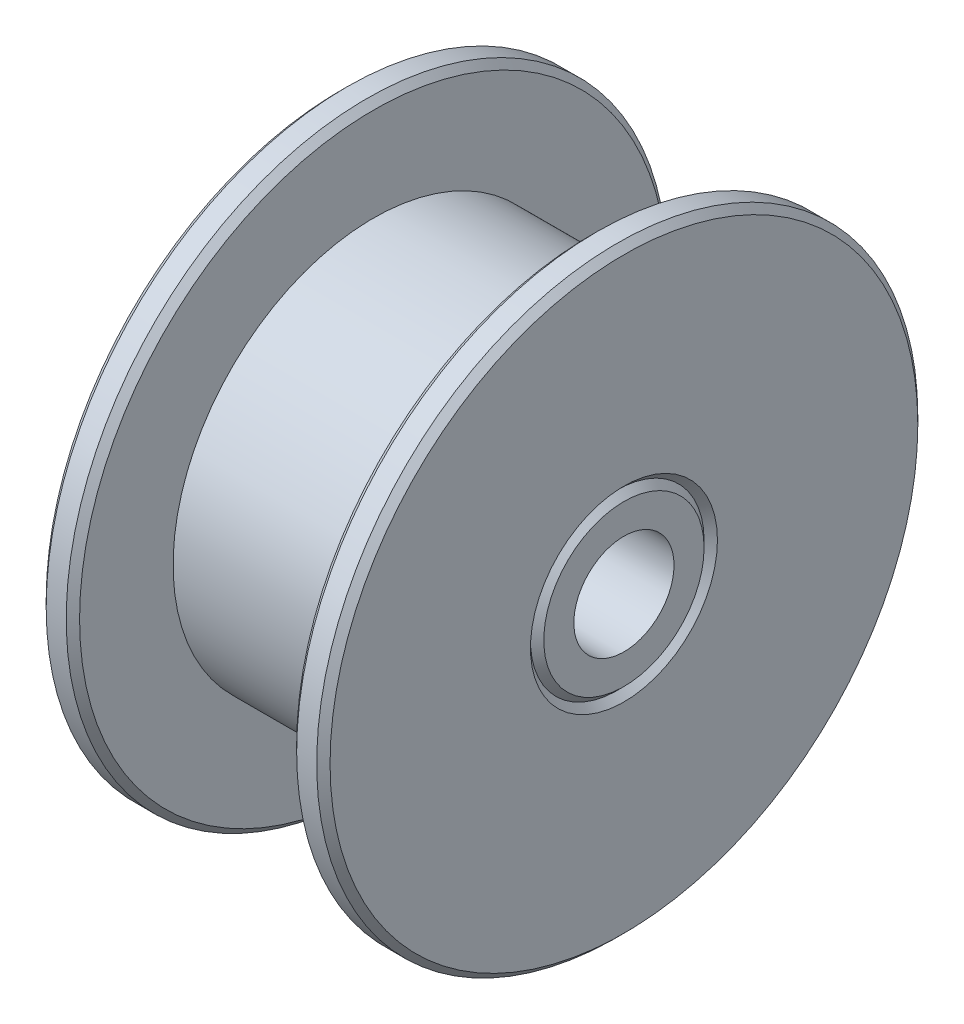
ISO-10303-21;
HEADER;
FILE_DESCRIPTION(('STEP AP214'),'2;1');
FILE_NAME('part.step','',(''),(''),'','','');
FILE_SCHEMA(('AUTOMOTIVE_DESIGN { 1 0 10303 214 1 1 1 1 }'));
ENDSEC;
DATA;
#1=APPLICATION_CONTEXT('core data for automotive mechanical design processes');
#2=APPLICATION_PROTOCOL_DEFINITION('international standard','automotive_design',2000,#1);
#3=PRODUCT_CONTEXT('',#1,'mechanical');
#4=PRODUCT('Part','Part','',(#3));
#5=PRODUCT_RELATED_PRODUCT_CATEGORY('part','',(#4));
#6=PRODUCT_DEFINITION_FORMATION('','',#4);
#7=PRODUCT_DEFINITION_CONTEXT('part definition',#1,'design');
#8=PRODUCT_DEFINITION('design','',#6,#7);
#9=PRODUCT_DEFINITION_SHAPE('','',#8);
#10=(LENGTH_UNIT() NAMED_UNIT(*) SI_UNIT(.MILLI.,.METRE.));
#11=(NAMED_UNIT(*) PLANE_ANGLE_UNIT() SI_UNIT($,.RADIAN.));
#12=(NAMED_UNIT(*) SI_UNIT($,.STERADIAN.) SOLID_ANGLE_UNIT());
#13=UNCERTAINTY_MEASURE_WITH_UNIT(LENGTH_MEASURE(1.E-05),#10,'distance_accuracy_value','');
#14=(GEOMETRIC_REPRESENTATION_CONTEXT(3) GLOBAL_UNCERTAINTY_ASSIGNED_CONTEXT((#13)) GLOBAL_UNIT_ASSIGNED_CONTEXT((#10,
#11,#12)) REPRESENTATION_CONTEXT('',''));
#15=CARTESIAN_POINT('',(0.,0.,0.));
#16=DIRECTION('',(0.,0.,1.));
#17=DIRECTION('',(1.,0.,0.));
#18=AXIS2_PLACEMENT_3D('',#15,#16,#17);
#19=CARTESIAN_POINT('',(-4.25,2.8,0.));
#20=DIRECTION('',(-1.,0.,0.));
#21=DIRECTION('',(0.,0.,1.));
#22=AXIS2_PLACEMENT_3D('',#19,#20,#21);
#23=PLANE('',#22);
#24=CARTESIAN_POINT('',(-4.25,0.,0.));
#25=DIRECTION('',(-1.,0.,0.));
#26=DIRECTION('',(0.,0.,1.));
#27=AXIS2_PLACEMENT_3D('',#24,#25,#26);
#28=CIRCLE('',#27,8.8);
#29=CARTESIAN_POINT('',(-4.25,0.,8.8));
#30=VERTEX_POINT('',#29);
#31=EDGE_CURVE('E10',#30,#30,#28,.T.);
#32=ORIENTED_EDGE('',*,*,#31,.T.);
#33=EDGE_LOOP('',(#32));
#34=FACE_BOUND('',#33,.T.);
#35=CARTESIAN_POINT('',(-4.25,0.,0.));
#36=DIRECTION('',(1.,0.,0.));
#37=DIRECTION('',(0.,0.,-1.));
#38=AXIS2_PLACEMENT_3D('',#35,#36,#37);
#39=CIRCLE('',#38,2.8);
#40=CARTESIAN_POINT('',(-4.25,0.,-2.8));
#41=VERTEX_POINT('',#40);
#42=EDGE_CURVE('E74',#41,#41,#39,.T.);
#43=ORIENTED_EDGE('',*,*,#42,.T.);
#44=EDGE_LOOP('',(#43));
#45=FACE_BOUND('',#44,.T.);
#46=ADVANCED_FACE('F30',(#34,#45),#23,.T.);
#47=CARTESIAN_POINT('',(0.,0.,0.));
#48=DIRECTION('',(1.,0.,0.));
#49=DIRECTION('',(0.,0.,-1.));
#50=AXIS2_PLACEMENT_3D('',#47,#48,#49);
#51=CYLINDRICAL_SURFACE('',#50,9.);
#52=CARTESIAN_POINT('',(-3.45,0.,0.));
#53=DIRECTION('',(1.,0.,0.));
#54=DIRECTION('',(0.,0.,-1.));
#55=AXIS2_PLACEMENT_3D('',#52,#53,#54);
#56=CIRCLE('',#55,9.);
#57=CARTESIAN_POINT('',(-3.45,0.,-9.));
#58=VERTEX_POINT('',#57);
#59=EDGE_CURVE('E37',#58,#58,#56,.F.);
#60=ORIENTED_EDGE('',*,*,#59,.T.);
#61=EDGE_LOOP('',(#60));
#62=FACE_BOUND('',#61,.T.);
#63=CARTESIAN_POINT('',(-4.05,0.,0.));
#64=DIRECTION('',(-1.,0.,0.));
#65=DIRECTION('',(0.,0.,1.));
#66=AXIS2_PLACEMENT_3D('',#63,#64,#65);
#67=CIRCLE('',#66,9.);
#68=CARTESIAN_POINT('',(-4.05,0.,9.));
#69=VERTEX_POINT('',#68);
#70=EDGE_CURVE('E41',#69,#69,#67,.F.);
#71=ORIENTED_EDGE('',*,*,#70,.T.);
#72=EDGE_LOOP('',(#71));
#73=FACE_BOUND('',#72,.T.);
#74=ADVANCED_FACE('F112',(#62,#73),#51,.T.);
#75=CARTESIAN_POINT('',(-3.25,9.,0.));
#76=DIRECTION('',(1.,0.,0.));
#77=DIRECTION('',(0.,0.,-1.));
#78=AXIS2_PLACEMENT_3D('',#75,#76,#77);
#79=PLANE('',#78);
#80=CARTESIAN_POINT('',(-3.25,0.,0.));
#81=DIRECTION('',(1.,0.,0.));
#82=DIRECTION('',(0.,0.,-1.));
#83=AXIS2_PLACEMENT_3D('',#80,#81,#82);
#84=CIRCLE('',#83,8.8);
#85=CARTESIAN_POINT('',(-3.25,0.,-8.8));
#86=VERTEX_POINT('',#85);
#87=EDGE_CURVE('E45',#86,#86,#84,.T.);
#88=ORIENTED_EDGE('',*,*,#87,.T.);
#89=EDGE_LOOP('',(#88));
#90=FACE_BOUND('',#89,.T.);
#91=CARTESIAN_POINT('',(-3.25,0.,0.));
#92=DIRECTION('',(1.,0.,0.));
#93=DIRECTION('',(0.,0.,-1.));
#94=AXIS2_PLACEMENT_3D('',#91,#92,#93);
#95=CIRCLE('',#94,6.);
#96=CARTESIAN_POINT('',(-3.25,0.,-6.));
#97=VERTEX_POINT('',#96);
#98=EDGE_CURVE('E62',#97,#97,#95,.T.);
#99=ORIENTED_EDGE('',*,*,#98,.F.);
#100=EDGE_LOOP('',(#99));
#101=FACE_BOUND('',#100,.T.);
#102=ADVANCED_FACE('F117',(#90,#101),#79,.T.);
#103=CARTESIAN_POINT('',(0.,0.,0.));
#104=DIRECTION('',(1.,0.,0.));
#105=DIRECTION('',(0.,0.,-1.));
#106=AXIS2_PLACEMENT_3D('',#103,#104,#105);
#107=CYLINDRICAL_SURFACE('',#106,6.);
#108=ORIENTED_EDGE('',*,*,#98,.T.);
#109=EDGE_LOOP('',(#108));
#110=FACE_BOUND('',#109,.T.);
#111=CARTESIAN_POINT('',(3.25,0.,0.));
#112=DIRECTION('',(1.,0.,0.));
#113=DIRECTION('',(0.,0.,-1.));
#114=AXIS2_PLACEMENT_3D('',#111,#112,#113);
#115=CIRCLE('',#114,6.);
#116=CARTESIAN_POINT('',(3.25,0.,-6.));
#117=VERTEX_POINT('',#116);
#118=EDGE_CURVE('E77',#117,#117,#115,.T.);
#119=ORIENTED_EDGE('',*,*,#118,.F.);
#120=EDGE_LOOP('',(#119));
#121=FACE_BOUND('',#120,.T.);
#122=ADVANCED_FACE('F141',(#110,#121),#107,.T.);
#123=CARTESIAN_POINT('',(0.,0.,0.));
#124=DIRECTION('',(1.,0.,0.));
#125=DIRECTION('',(0.,0.,-1.));
#126=AXIS2_PLACEMENT_3D('',#123,#124,#125);
#127=CYLINDRICAL_SURFACE('',#126,1.5);
#128=CARTESIAN_POINT('',(-4.25,0.,0.));
#129=DIRECTION('',(1.,0.,0.));
#130=DIRECTION('',(0.,0.,-1.));
#131=AXIS2_PLACEMENT_3D('',#128,#129,#130);
#132=CIRCLE('',#131,1.5);
#133=CARTESIAN_POINT('',(-4.25,0.,-1.5));
#134=VERTEX_POINT('',#133);
#135=EDGE_CURVE('E65',#134,#134,#132,.T.);
#136=ORIENTED_EDGE('',*,*,#135,.F.);
#137=EDGE_LOOP('',(#136));
#138=FACE_BOUND('',#137,.T.);
#139=CARTESIAN_POINT('',(4.25,0.,0.));
#140=DIRECTION('',(1.,0.,0.));
#141=DIRECTION('',(0.,0.,-1.));
#142=AXIS2_PLACEMENT_3D('',#139,#140,#141);
#143=CIRCLE('',#142,1.5);
#144=CARTESIAN_POINT('',(4.25,0.,-1.5));
#145=VERTEX_POINT('',#144);
#146=EDGE_CURVE('E80',#145,#145,#143,.T.);
#147=ORIENTED_EDGE('',*,*,#146,.T.);
#148=EDGE_LOOP('',(#147));
#149=FACE_BOUND('',#148,.T.);
#150=ADVANCED_FACE('F146',(#138,#149),#127,.F.);
#151=CARTESIAN_POINT('',(-4.25,1.5,0.));
#152=DIRECTION('',(-1.,0.,0.));
#153=DIRECTION('',(0.,0.,1.));
#154=AXIS2_PLACEMENT_3D('',#151,#152,#153);
#155=PLANE('',#154);
#156=ORIENTED_EDGE('',*,*,#135,.T.);
#157=EDGE_LOOP('',(#156));
#158=FACE_BOUND('',#157,.T.);
#159=CARTESIAN_POINT('',(-4.25,0.,0.));
#160=DIRECTION('',(1.,0.,0.));
#161=DIRECTION('',(0.,0.,-1.));
#162=AXIS2_PLACEMENT_3D('',#159,#160,#161);
#163=CIRCLE('',#162,2.40000000000006);
#164=CARTESIAN_POINT('',(-4.25,0.,-2.40000000000006));
#165=VERTEX_POINT('',#164);
#166=EDGE_CURVE('E68',#165,#165,#163,.T.);
#167=ORIENTED_EDGE('',*,*,#166,.F.);
#168=EDGE_LOOP('',(#167));
#169=FACE_BOUND('',#168,.T.);
#170=ADVANCED_FACE('F228',(#158,#169),#155,.T.);
#171=CARTESIAN_POINT('',(-4.05,0.,0.));
#172=DIRECTION('',(1.,0.,0.));
#173=DIRECTION('',(0.,0.,-1.));
#174=AXIS2_PLACEMENT_3D('',#171,#172,#173);
#175=CONICAL_SURFACE('',#174,2.6,0.785398163397305);
#176=ORIENTED_EDGE('',*,*,#166,.T.);
#177=EDGE_LOOP('',(#176));
#178=FACE_BOUND('',#177,.T.);
#179=CARTESIAN_POINT('',(-4.05,0.,0.));
#180=DIRECTION('',(1.,0.,0.));
#181=DIRECTION('',(0.,0.,-1.));
#182=AXIS2_PLACEMENT_3D('',#179,#180,#181);
#183=CIRCLE('',#182,2.6);
#184=CARTESIAN_POINT('',(-4.05,0.,-2.6));
#185=VERTEX_POINT('',#184);
#186=EDGE_CURVE('E71',#185,#185,#183,.T.);
#187=ORIENTED_EDGE('',*,*,#186,.F.);
#188=EDGE_LOOP('',(#187));
#189=FACE_BOUND('',#188,.T.);
#190=ADVANCED_FACE('F108',(#178,#189),#175,.T.);
#191=CARTESIAN_POINT('',(-4.25,0.,0.));
#192=DIRECTION('',(-1.,0.,0.));
#193=DIRECTION('',(0.,0.,1.));
#194=AXIS2_PLACEMENT_3D('',#191,#192,#193);
#195=CONICAL_SURFACE('',#194,2.8,0.785398163397448);
#196=ORIENTED_EDGE('',*,*,#186,.T.);
#197=EDGE_LOOP('',(#196));
#198=FACE_BOUND('',#197,.T.);
#199=ORIENTED_EDGE('',*,*,#42,.F.);
#200=EDGE_LOOP('',(#199));
#201=FACE_BOUND('',#200,.T.);
#202=ADVANCED_FACE('F98',(#198,#201),#195,.F.);
#203=CARTESIAN_POINT('',(4.25,2.8,0.));
#204=DIRECTION('',(1.,0.,0.));
#205=DIRECTION('',(0.,0.,1.));
#206=AXIS2_PLACEMENT_3D('',#203,#204,#205);
#207=PLANE('',#206);
#208=CARTESIAN_POINT('',(4.25,0.,0.));
#209=DIRECTION('',(1.,0.,0.));
#210=DIRECTION('',(0.,0.,-1.));
#211=AXIS2_PLACEMENT_3D('',#208,#209,#210);
#212=CIRCLE('',#211,8.8);
#213=CARTESIAN_POINT('',(4.25,0.,-8.8));
#214=VERTEX_POINT('',#213);
#215=EDGE_CURVE('E50',#214,#214,#212,.T.);
#216=ORIENTED_EDGE('',*,*,#215,.T.);
#217=EDGE_LOOP('',(#216));
#218=FACE_BOUND('',#217,.T.);
#219=CARTESIAN_POINT('',(4.25,0.,0.));
#220=DIRECTION('',(1.,0.,0.));
#221=DIRECTION('',(0.,0.,-1.));
#222=AXIS2_PLACEMENT_3D('',#219,#220,#221);
#223=CIRCLE('',#222,2.8);
#224=CARTESIAN_POINT('',(4.25,0.,-2.8));
#225=VERTEX_POINT('',#224);
#226=EDGE_CURVE('E89',#225,#225,#223,.T.);
#227=ORIENTED_EDGE('',*,*,#226,.F.);
#228=EDGE_LOOP('',(#227));
#229=FACE_BOUND('',#228,.T.);
#230=ADVANCED_FACE('F95',(#218,#229),#207,.T.);
#231=CARTESIAN_POINT('',(0.,0.,0.));
#232=DIRECTION('',(-1.,0.,0.));
#233=DIRECTION('',(0.,0.,-1.));
#234=AXIS2_PLACEMENT_3D('',#231,#232,#233);
#235=CYLINDRICAL_SURFACE('',#234,9.);
#236=CARTESIAN_POINT('',(3.45,0.,0.));
#237=DIRECTION('',(-1.,0.,0.));
#238=DIRECTION('',(0.,0.,1.));
#239=AXIS2_PLACEMENT_3D('',#236,#237,#238);
#240=CIRCLE('',#239,9.);
#241=CARTESIAN_POINT('',(3.45,0.,9.));
#242=VERTEX_POINT('',#241);
#243=EDGE_CURVE('E56',#242,#242,#240,.F.);
#244=ORIENTED_EDGE('',*,*,#243,.T.);
#245=EDGE_LOOP('',(#244));
#246=FACE_BOUND('',#245,.T.);
#247=CARTESIAN_POINT('',(4.05,0.,0.));
#248=DIRECTION('',(1.,0.,0.));
#249=DIRECTION('',(0.,0.,-1.));
#250=AXIS2_PLACEMENT_3D('',#247,#248,#249);
#251=CIRCLE('',#250,9.);
#252=CARTESIAN_POINT('',(4.05,0.,-9.));
#253=VERTEX_POINT('',#252);
#254=EDGE_CURVE('E59',#253,#253,#251,.F.);
#255=ORIENTED_EDGE('',*,*,#254,.T.);
#256=EDGE_LOOP('',(#255));
#257=FACE_BOUND('',#256,.T.);
#258=ADVANCED_FACE('F97',(#246,#257),#235,.T.);
#259=CARTESIAN_POINT('',(3.25,9.,0.));
#260=DIRECTION('',(-1.,0.,0.));
#261=DIRECTION('',(0.,0.,-1.));
#262=AXIS2_PLACEMENT_3D('',#259,#260,#261);
#263=PLANE('',#262);
#264=CARTESIAN_POINT('',(3.25,0.,0.));
#265=DIRECTION('',(-1.,0.,0.));
#266=DIRECTION('',(0.,0.,1.));
#267=AXIS2_PLACEMENT_3D('',#264,#265,#266);
#268=CIRCLE('',#267,8.8);
#269=CARTESIAN_POINT('',(3.25,0.,8.8));
#270=VERTEX_POINT('',#269);
#271=EDGE_CURVE('E53',#270,#270,#268,.T.);
#272=ORIENTED_EDGE('',*,*,#271,.T.);
#273=EDGE_LOOP('',(#272));
#274=FACE_BOUND('',#273,.T.);
#275=ORIENTED_EDGE('',*,*,#118,.T.);
#276=EDGE_LOOP('',(#275));
#277=FACE_BOUND('',#276,.T.);
#278=ADVANCED_FACE('F105',(#274,#277),#263,.T.);
#279=CARTESIAN_POINT('',(4.25,1.5,0.));
#280=DIRECTION('',(1.,0.,0.));
#281=DIRECTION('',(0.,0.,1.));
#282=AXIS2_PLACEMENT_3D('',#279,#280,#281);
#283=PLANE('',#282);
#284=ORIENTED_EDGE('',*,*,#146,.F.);
#285=EDGE_LOOP('',(#284));
#286=FACE_BOUND('',#285,.T.);
#287=CARTESIAN_POINT('',(4.25,0.,0.));
#288=DIRECTION('',(1.,0.,0.));
#289=DIRECTION('',(0.,0.,-1.));
#290=AXIS2_PLACEMENT_3D('',#287,#288,#289);
#291=CIRCLE('',#290,2.40000000000006);
#292=CARTESIAN_POINT('',(4.25,0.,-2.40000000000006));
#293=VERTEX_POINT('',#292);
#294=EDGE_CURVE('E83',#293,#293,#291,.T.);
#295=ORIENTED_EDGE('',*,*,#294,.T.);
#296=EDGE_LOOP('',(#295));
#297=FACE_BOUND('',#296,.T.);
#298=ADVANCED_FACE('F151',(#286,#297),#283,.T.);
#299=CARTESIAN_POINT('',(4.05,0.,0.));
#300=DIRECTION('',(-1.,0.,0.));
#301=DIRECTION('',(0.,0.,-1.));
#302=AXIS2_PLACEMENT_3D('',#299,#300,#301);
#303=CONICAL_SURFACE('',#302,2.6,0.785398163397305);
#304=ORIENTED_EDGE('',*,*,#294,.F.);
#305=EDGE_LOOP('',(#304));
#306=FACE_BOUND('',#305,.T.);
#307=CARTESIAN_POINT('',(4.05,0.,0.));
#308=DIRECTION('',(1.,0.,0.));
#309=DIRECTION('',(0.,0.,-1.));
#310=AXIS2_PLACEMENT_3D('',#307,#308,#309);
#311=CIRCLE('',#310,2.6);
#312=CARTESIAN_POINT('',(4.05,0.,-2.6));
#313=VERTEX_POINT('',#312);
#314=EDGE_CURVE('E86',#313,#313,#311,.T.);
#315=ORIENTED_EDGE('',*,*,#314,.T.);
#316=EDGE_LOOP('',(#315));
#317=FACE_BOUND('',#316,.T.);
#318=ADVANCED_FACE('F157',(#306,#317),#303,.T.);
#319=CARTESIAN_POINT('',(4.25,0.,0.));
#320=DIRECTION('',(1.,0.,0.));
#321=DIRECTION('',(0.,0.,1.));
#322=AXIS2_PLACEMENT_3D('',#319,#320,#321);
#323=CONICAL_SURFACE('',#322,2.8,0.785398163397448);
#324=ORIENTED_EDGE('',*,*,#314,.F.);
#325=EDGE_LOOP('',(#324));
#326=FACE_BOUND('',#325,.T.);
#327=ORIENTED_EDGE('',*,*,#226,.T.);
#328=EDGE_LOOP('',(#327));
#329=FACE_BOUND('',#328,.T.);
#330=ADVANCED_FACE('F93',(#326,#329),#323,.F.);
#331=CARTESIAN_POINT('',(3.45,0.,0.));
#332=DIRECTION('',(1.,0.,0.));
#333=DIRECTION('',(0.,0.,-1.));
#334=AXIS2_PLACEMENT_3D('',#331,#332,#333);
#335=CONICAL_SURFACE('',#334,9.,0.785398163397453);
#336=ORIENTED_EDGE('',*,*,#271,.F.);
#337=EDGE_LOOP('',(#336));
#338=FACE_BOUND('',#337,.T.);
#339=ORIENTED_EDGE('',*,*,#243,.F.);
#340=EDGE_LOOP('',(#339));
#341=FACE_BOUND('',#340,.T.);
#342=ADVANCED_FACE('F122',(#338,#341),#335,.T.);
#343=CARTESIAN_POINT('',(4.25,0.,0.));
#344=DIRECTION('',(-1.,0.,0.));
#345=DIRECTION('',(0.,0.,1.));
#346=AXIS2_PLACEMENT_3D('',#343,#344,#345);
#347=CONICAL_SURFACE('',#346,8.8,0.785398163397448);
#348=ORIENTED_EDGE('',*,*,#254,.F.);
#349=EDGE_LOOP('',(#348));
#350=FACE_BOUND('',#349,.T.);
#351=ORIENTED_EDGE('',*,*,#215,.F.);
#352=EDGE_LOOP('',(#351));
#353=FACE_BOUND('',#352,.T.);
#354=ADVANCED_FACE('F125',(#350,#353),#347,.T.);
#355=CARTESIAN_POINT('',(-3.25,0.,0.));
#356=DIRECTION('',(-1.,0.,0.));
#357=DIRECTION('',(0.,0.,1.));
#358=AXIS2_PLACEMENT_3D('',#355,#356,#357);
#359=CONICAL_SURFACE('',#358,8.8,0.785398163397448);
#360=ORIENTED_EDGE('',*,*,#59,.F.);
#361=EDGE_LOOP('',(#360));
#362=FACE_BOUND('',#361,.T.);
#363=ORIENTED_EDGE('',*,*,#87,.F.);
#364=EDGE_LOOP('',(#363));
#365=FACE_BOUND('',#364,.T.);
#366=ADVANCED_FACE('F128',(#362,#365),#359,.T.);
#367=CARTESIAN_POINT('',(-4.05,0.,0.));
#368=DIRECTION('',(1.,0.,0.));
#369=DIRECTION('',(0.,0.,-1.));
#370=AXIS2_PLACEMENT_3D('',#367,#368,#369);
#371=CONICAL_SURFACE('',#370,9.,0.785398163397453);
#372=ORIENTED_EDGE('',*,*,#31,.F.);
#373=EDGE_LOOP('',(#372));
#374=FACE_BOUND('',#373,.T.);
#375=ORIENTED_EDGE('',*,*,#70,.F.);
#376=EDGE_LOOP('',(#375));
#377=FACE_BOUND('',#376,.T.);
#378=ADVANCED_FACE('F32',(#374,#377),#371,.T.);
#379=CLOSED_SHELL('',(#46,#74,#102,#122,#150,#170,#190,#202,#230,#258,#278,#298,#318,#330,#342,
#354,#366,#378));
#380=MANIFOLD_SOLID_BREP('B2',#379);
#381=ADVANCED_BREP_SHAPE_REPRESENTATION('',(#18,#380),#14);
#382=SHAPE_DEFINITION_REPRESENTATION(#9,#381);
ENDSEC;
END-ISO-10303-21;
